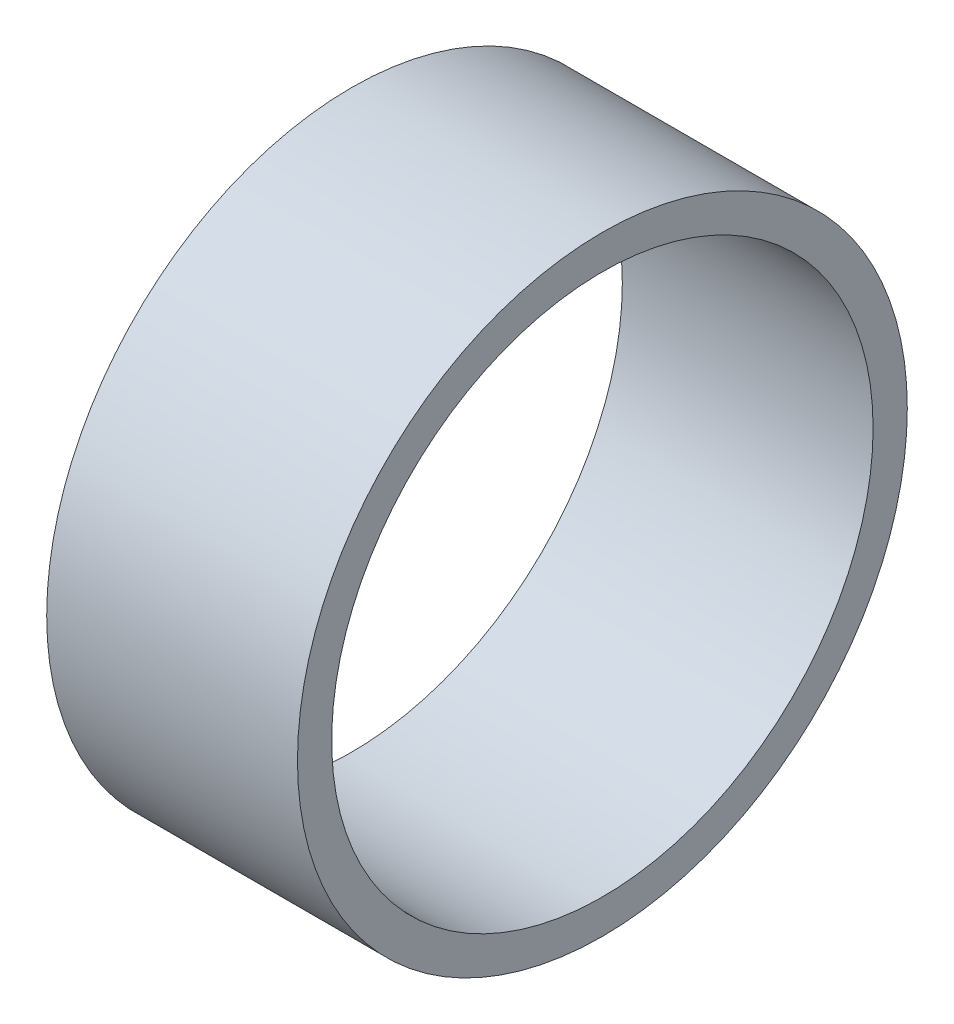
ISO-10303-21;
HEADER;
FILE_DESCRIPTION(('STEP AP214'),'2;1');
FILE_NAME('part.step','',(''),(''),'','','');
FILE_SCHEMA(('AUTOMOTIVE_DESIGN { 1 0 10303 214 1 1 1 1 }'));
ENDSEC;
DATA;
#1=APPLICATION_CONTEXT('core data for automotive mechanical design processes');
#2=APPLICATION_PROTOCOL_DEFINITION('international standard','automotive_design',2000,#1);
#3=PRODUCT_CONTEXT('',#1,'mechanical');
#4=PRODUCT('Part','Part','',(#3));
#5=PRODUCT_RELATED_PRODUCT_CATEGORY('part','',(#4));
#6=PRODUCT_DEFINITION_FORMATION('','',#4);
#7=PRODUCT_DEFINITION_CONTEXT('part definition',#1,'design');
#8=PRODUCT_DEFINITION('design','',#6,#7);
#9=PRODUCT_DEFINITION_SHAPE('','',#8);
#10=(LENGTH_UNIT() NAMED_UNIT(*) SI_UNIT(.MILLI.,.METRE.));
#11=(NAMED_UNIT(*) PLANE_ANGLE_UNIT() SI_UNIT($,.RADIAN.));
#12=(NAMED_UNIT(*) SI_UNIT($,.STERADIAN.) SOLID_ANGLE_UNIT());
#13=UNCERTAINTY_MEASURE_WITH_UNIT(LENGTH_MEASURE(1.E-05),#10,'distance_accuracy_value','');
#14=(GEOMETRIC_REPRESENTATION_CONTEXT(3) GLOBAL_UNCERTAINTY_ASSIGNED_CONTEXT((#13)) GLOBAL_UNIT_ASSIGNED_CONTEXT((#10,
#11,#12)) REPRESENTATION_CONTEXT('',''));
#15=CARTESIAN_POINT('',(0.,0.,0.));
#16=DIRECTION('',(0.,0.,1.));
#17=DIRECTION('',(1.,0.,0.));
#18=AXIS2_PLACEMENT_3D('',#15,#16,#17);
#19=CARTESIAN_POINT('',(44.,0.,0.));
#20=DIRECTION('',(1.,0.,0.));
#21=DIRECTION('',(0.,0.,-1.));
#22=AXIS2_PLACEMENT_3D('',#19,#20,#21);
#23=PLANE('',#22);
#24=CARTESIAN_POINT('',(44.,0.,0.));
#25=DIRECTION('',(1.,0.,0.));
#26=DIRECTION('',(0.,0.,-1.));
#27=AXIS2_PLACEMENT_3D('',#24,#25,#26);
#28=CIRCLE('',#27,53.5);
#29=CARTESIAN_POINT('',(44.,0.,-53.5));
#30=VERTEX_POINT('',#29);
#31=EDGE_CURVE('E10',#30,#30,#28,.T.);
#32=ORIENTED_EDGE('',*,*,#31,.T.);
#33=EDGE_LOOP('',(#32));
#34=FACE_BOUND('',#33,.T.);
#35=CARTESIAN_POINT('',(44.,0.,0.));
#36=DIRECTION('',(1.,0.,0.));
#37=DIRECTION('',(0.,0.,-1.));
#38=AXIS2_PLACEMENT_3D('',#35,#36,#37);
#39=CIRCLE('',#38,47.5);
#40=CARTESIAN_POINT('',(44.,0.,-47.5));
#41=VERTEX_POINT('',#40);
#42=EDGE_CURVE('E41',#41,#41,#39,.T.);
#43=ORIENTED_EDGE('',*,*,#42,.F.);
#44=EDGE_LOOP('',(#43));
#45=FACE_BOUND('',#44,.T.);
#46=ADVANCED_FACE('F30',(#34,#45),#23,.T.);
#47=CARTESIAN_POINT('',(0.,0.,0.));
#48=DIRECTION('',(1.,0.,0.));
#49=DIRECTION('',(0.,0.,-1.));
#50=AXIS2_PLACEMENT_3D('',#47,#48,#49);
#51=PLANE('',#50);
#52=CARTESIAN_POINT('',(0.,0.,0.));
#53=DIRECTION('',(1.,0.,0.));
#54=DIRECTION('',(0.,0.,-1.));
#55=AXIS2_PLACEMENT_3D('',#52,#53,#54);
#56=CIRCLE('',#55,53.5);
#57=CARTESIAN_POINT('',(0.,0.,-53.5));
#58=VERTEX_POINT('',#57);
#59=EDGE_CURVE('E34',#58,#58,#56,.T.);
#60=ORIENTED_EDGE('',*,*,#59,.F.);
#61=EDGE_LOOP('',(#60));
#62=FACE_BOUND('',#61,.T.);
#63=CARTESIAN_POINT('',(0.,0.,0.));
#64=DIRECTION('',(1.,0.,0.));
#65=DIRECTION('',(0.,0.,-1.));
#66=AXIS2_PLACEMENT_3D('',#63,#64,#65);
#67=CIRCLE('',#66,47.5);
#68=CARTESIAN_POINT('',(0.,0.,-47.5));
#69=VERTEX_POINT('',#68);
#70=EDGE_CURVE('E43',#69,#69,#67,.T.);
#71=ORIENTED_EDGE('',*,*,#70,.T.);
#72=EDGE_LOOP('',(#71));
#73=FACE_BOUND('',#72,.T.);
#74=ADVANCED_FACE('F53',(#62,#73),#51,.F.);
#75=CARTESIAN_POINT('',(44.,0.,0.));
#76=DIRECTION('',(-1.,0.,0.));
#77=DIRECTION('',(0.,0.,1.));
#78=AXIS2_PLACEMENT_3D('',#75,#76,#77);
#79=CYLINDRICAL_SURFACE('',#78,53.5);
#80=ORIENTED_EDGE('',*,*,#31,.F.);
#81=EDGE_LOOP('',(#80));
#82=FACE_BOUND('',#81,.T.);
#83=ORIENTED_EDGE('',*,*,#59,.T.);
#84=EDGE_LOOP('',(#83));
#85=FACE_BOUND('',#84,.T.);
#86=ADVANCED_FACE('F32',(#82,#85),#79,.T.);
#87=CARTESIAN_POINT('',(44.,0.,0.));
#88=DIRECTION('',(-1.,0.,0.));
#89=DIRECTION('',(0.,0.,1.));
#90=AXIS2_PLACEMENT_3D('',#87,#88,#89);
#91=CYLINDRICAL_SURFACE('',#90,47.5);
#92=ORIENTED_EDGE('',*,*,#42,.T.);
#93=EDGE_LOOP('',(#92));
#94=FACE_BOUND('',#93,.T.);
#95=ORIENTED_EDGE('',*,*,#70,.F.);
#96=EDGE_LOOP('',(#95));
#97=FACE_BOUND('',#96,.T.);
#98=ADVANCED_FACE('F49',(#94,#97),#91,.F.);
#99=CLOSED_SHELL('',(#46,#74,#86,#98));
#100=MANIFOLD_SOLID_BREP('B2',#99);
#101=ADVANCED_BREP_SHAPE_REPRESENTATION('',(#18,#100),#14);
#102=SHAPE_DEFINITION_REPRESENTATION(#9,#101);
ENDSEC;
END-ISO-10303-21;
